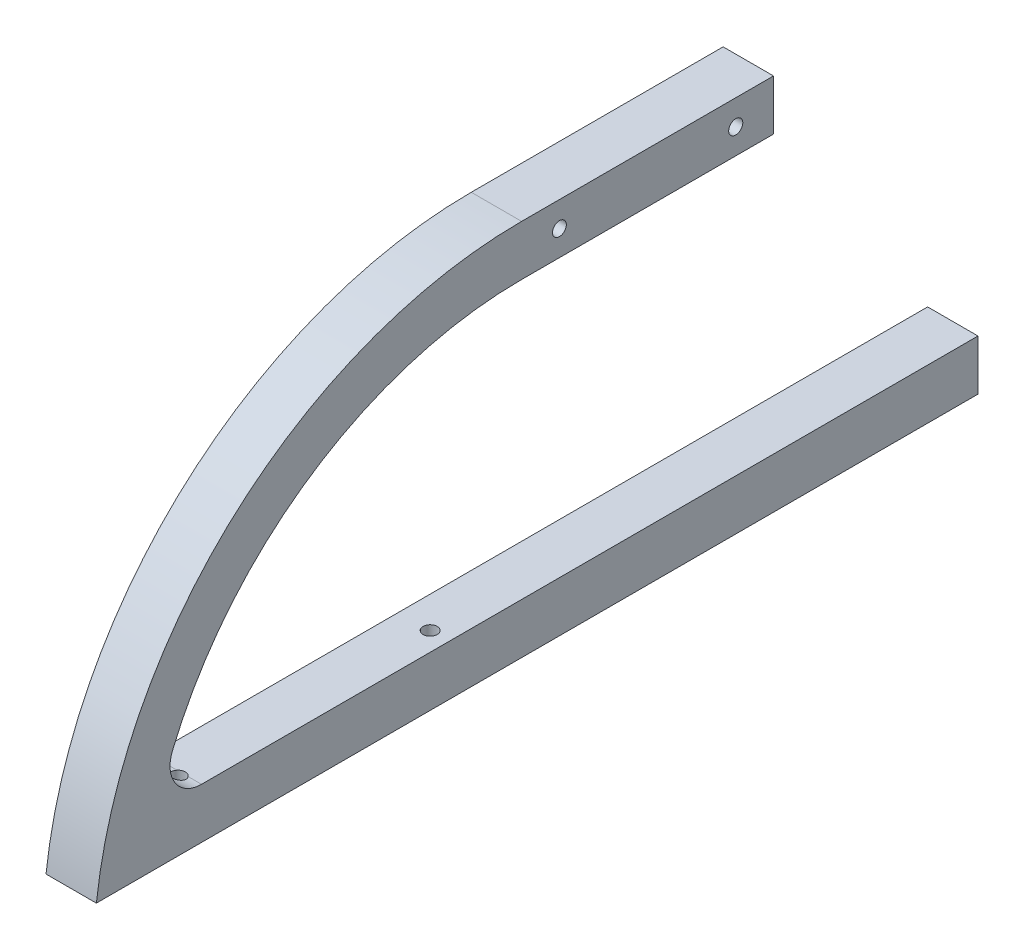
ISO-10303-21;
HEADER;
FILE_DESCRIPTION(('STEP AP214'),'2;1');
FILE_NAME('part.step','',(''),(''),'','','');
FILE_SCHEMA(('AUTOMOTIVE_DESIGN { 1 0 10303 214 1 1 1 1 }'));
ENDSEC;
DATA;
#1=APPLICATION_CONTEXT('core data for automotive mechanical design processes');
#2=APPLICATION_PROTOCOL_DEFINITION('international standard','automotive_design',2000,#1);
#3=PRODUCT_CONTEXT('',#1,'mechanical');
#4=PRODUCT('Part','Part','',(#3));
#5=PRODUCT_RELATED_PRODUCT_CATEGORY('part','',(#4));
#6=PRODUCT_DEFINITION_FORMATION('','',#4);
#7=PRODUCT_DEFINITION_CONTEXT('part definition',#1,'design');
#8=PRODUCT_DEFINITION('design','',#6,#7);
#9=PRODUCT_DEFINITION_SHAPE('','',#8);
#10=(LENGTH_UNIT() NAMED_UNIT(*) SI_UNIT(.MILLI.,.METRE.));
#11=(NAMED_UNIT(*) PLANE_ANGLE_UNIT() SI_UNIT($,.RADIAN.));
#12=(NAMED_UNIT(*) SI_UNIT($,.STERADIAN.) SOLID_ANGLE_UNIT());
#13=UNCERTAINTY_MEASURE_WITH_UNIT(LENGTH_MEASURE(1.E-05),#10,'distance_accuracy_value','');
#14=(GEOMETRIC_REPRESENTATION_CONTEXT(3) GLOBAL_UNCERTAINTY_ASSIGNED_CONTEXT((#13)) GLOBAL_UNIT_ASSIGNED_CONTEXT((#10,
#11,#12)) REPRESENTATION_CONTEXT('',''));
#15=CARTESIAN_POINT('',(0.,0.,0.));
#16=DIRECTION('',(0.,0.,1.));
#17=DIRECTION('',(1.,0.,0.));
#18=AXIS2_PLACEMENT_3D('',#15,#16,#17);
#19=CARTESIAN_POINT('',(0.,-86.36,50.8));
#20=DIRECTION('',(1.,0.,0.));
#21=DIRECTION('',(0.,0.,-1.));
#22=AXIS2_PLACEMENT_3D('',#19,#20,#21);
#23=PLANE('',#22);
#24=DIRECTION('',(0.,1.,0.));
#25=VECTOR('',#24,1.);
#26=CARTESIAN_POINT('',(0.,0.,0.));
#27=LINE('',#26,#25);
#28=CARTESIAN_POINT('',(0.,-10.16,0.));
#29=VERTEX_POINT('',#28);
#30=CARTESIAN_POINT('',(0.,0.,0.));
#31=VERTEX_POINT('',#30);
#32=EDGE_CURVE('E146',#29,#31,#27,.T.);
#33=ORIENTED_EDGE('',*,*,#32,.F.);
#34=DIRECTION('',(0.,0.,-1.));
#35=VECTOR('',#34,1.);
#36=CARTESIAN_POINT('',(0.,-10.16,0.));
#37=LINE('',#36,#35);
#38=CARTESIAN_POINT('',(0.,-10.16,50.8));
#39=VERTEX_POINT('',#38);
#40=EDGE_CURVE('E93',#39,#29,#37,.T.);
#41=ORIENTED_EDGE('',*,*,#40,.F.);
#42=CARTESIAN_POINT('',(0.,-86.36,50.8));
#43=DIRECTION('',(-1.,0.,0.));
#44=DIRECTION('',(0.,0.,-1.));
#45=AXIS2_PLACEMENT_3D('',#42,#43,#44);
#46=CIRCLE('',#45,76.2);
#47=CARTESIAN_POINT('',(0.,-57.2654545454546,121.226894186762));
#48=VERTEX_POINT('',#47);
#49=EDGE_CURVE('E162',#48,#39,#46,.T.);
#50=ORIENTED_EDGE('',*,*,#49,.F.);
#51=CARTESIAN_POINT('',(0.,-59.69,115.357986337865));
#52=DIRECTION('',(-1.,0.,0.));
#53=DIRECTION('',(0.,0.,1.));
#54=AXIS2_PLACEMENT_3D('',#51,#52,#53);
#55=CIRCLE('',#54,6.34999999999998);
#56=CARTESIAN_POINT('',(0.,-66.04,115.357986337865));
#57=VERTEX_POINT('',#56);
#58=EDGE_CURVE('E134',#57,#48,#55,.T.);
#59=ORIENTED_EDGE('',*,*,#58,.F.);
#60=DIRECTION('',(0.,0.,1.));
#61=VECTOR('',#60,1.);
#62=CARTESIAN_POINT('',(0.,-66.04,115.357986337865));
#63=LINE('',#62,#61);
#64=CARTESIAN_POINT('',(0.,-66.04,-41.2397294780386));
#65=VERTEX_POINT('',#64);
#66=EDGE_CURVE('E158',#65,#57,#63,.T.);
#67=ORIENTED_EDGE('',*,*,#66,.F.);
#68=DIRECTION('',(0.,1.,0.));
#69=VECTOR('',#68,1.);
#70=CARTESIAN_POINT('',(0.,-66.04,-41.2397294780386));
#71=LINE('',#70,#69);
#72=CARTESIAN_POINT('',(0.,-76.2,-41.2397294780386));
#73=VERTEX_POINT('',#72);
#74=EDGE_CURVE('E156',#73,#65,#71,.T.);
#75=ORIENTED_EDGE('',*,*,#74,.F.);
#76=DIRECTION('',(0.,0.,-1.));
#77=VECTOR('',#76,1.);
#78=CARTESIAN_POINT('',(0.,-76.2,136.560270521961));
#79=LINE('',#78,#77);
#80=CARTESIAN_POINT('',(0.,-76.2,136.560270521961));
#81=VERTEX_POINT('',#80);
#82=EDGE_CURVE('E154',#81,#73,#79,.T.);
#83=ORIENTED_EDGE('',*,*,#82,.F.);
#84=CARTESIAN_POINT('',(0.,-86.36,50.8));
#85=DIRECTION('',(1.,0.,0.));
#86=DIRECTION('',(0.,0.,-1.));
#87=AXIS2_PLACEMENT_3D('',#84,#85,#86);
#88=CIRCLE('',#87,86.36);
#89=CARTESIAN_POINT('',(0.,0.,50.8));
#90=VERTEX_POINT('',#89);
#91=EDGE_CURVE('E152',#90,#81,#88,.T.);
#92=ORIENTED_EDGE('',*,*,#91,.F.);
#93=DIRECTION('',(0.,0.,1.));
#94=VECTOR('',#93,1.);
#95=CARTESIAN_POINT('',(0.,0.,0.));
#96=LINE('',#95,#94);
#97=EDGE_CURVE('E149',#31,#90,#96,.T.);
#98=ORIENTED_EDGE('',*,*,#97,.F.);
#99=EDGE_LOOP('',(#33,#41,#50,#59,#67,#75,#83,#92,#98));
#100=FACE_BOUND('',#99,.T.);
#101=CARTESIAN_POINT('',(0.,-5.08,7.62));
#102=DIRECTION('',(-1.,0.,0.));
#103=DIRECTION('',(0.,0.,1.));
#104=AXIS2_PLACEMENT_3D('',#101,#102,#103);
#105=CIRCLE('',#104,3.8989);
#106=CARTESIAN_POINT('',(0.,-5.08,11.5189));
#107=VERTEX_POINT('',#106);
#108=EDGE_CURVE('E306',#107,#107,#105,.T.);
#109=ORIENTED_EDGE('',*,*,#108,.F.);
#110=EDGE_LOOP('',(#109));
#111=FACE_BOUND('',#110,.T.);
#112=CARTESIAN_POINT('',(0.,-5.08,43.18));
#113=DIRECTION('',(-1.,0.,0.));
#114=DIRECTION('',(0.,0.,1.));
#115=AXIS2_PLACEMENT_3D('',#112,#113,#114);
#116=CIRCLE('',#115,3.8989);
#117=CARTESIAN_POINT('',(0.,-5.08,47.0789));
#118=VERTEX_POINT('',#117);
#119=EDGE_CURVE('E316',#118,#118,#116,.T.);
#120=ORIENTED_EDGE('',*,*,#119,.F.);
#121=EDGE_LOOP('',(#120));
#122=FACE_BOUND('',#121,.T.);
#123=ADVANCED_FACE('F33',(#100,#111,#122),#23,.F.);
#124=CARTESIAN_POINT('',(10.16,0.,0.));
#125=DIRECTION('',(0.,0.,1.));
#126=DIRECTION('',(0.,-1.,0.));
#127=AXIS2_PLACEMENT_3D('',#124,#125,#126);
#128=PLANE('',#127);
#129=ORIENTED_EDGE('',*,*,#32,.T.);
#130=DIRECTION('',(-1.,0.,0.));
#131=VECTOR('',#130,1.);
#132=CARTESIAN_POINT('',(10.16,0.,0.));
#133=LINE('',#132,#131);
#134=CARTESIAN_POINT('',(10.16,0.,0.));
#135=VERTEX_POINT('',#134);
#136=EDGE_CURVE('E11',#135,#31,#133,.T.);
#137=ORIENTED_EDGE('',*,*,#136,.F.);
#138=DIRECTION('',(0.,1.,0.));
#139=VECTOR('',#138,1.);
#140=CARTESIAN_POINT('',(10.16,0.,0.));
#141=LINE('',#140,#139);
#142=CARTESIAN_POINT('',(10.16,-10.16,0.));
#143=VERTEX_POINT('',#142);
#144=EDGE_CURVE('E165',#143,#135,#141,.T.);
#145=ORIENTED_EDGE('',*,*,#144,.F.);
#146=DIRECTION('',(-1.,0.,0.));
#147=VECTOR('',#146,1.);
#148=CARTESIAN_POINT('',(10.16,-10.16,0.));
#149=LINE('',#148,#147);
#150=EDGE_CURVE('E142',#143,#29,#149,.T.);
#151=ORIENTED_EDGE('',*,*,#150,.T.);
#152=EDGE_LOOP('',(#129,#137,#145,#151));
#153=FACE_BOUND('',#152,.T.);
#154=ADVANCED_FACE('F35',(#153),#128,.F.);
#155=CARTESIAN_POINT('',(10.16,0.,0.));
#156=DIRECTION('',(0.,-1.,0.));
#157=DIRECTION('',(0.,0.,-1.));
#158=AXIS2_PLACEMENT_3D('',#155,#156,#157);
#159=PLANE('',#158);
#160=ORIENTED_EDGE('',*,*,#97,.T.);
#161=DIRECTION('',(-1.,0.,0.));
#162=VECTOR('',#161,1.);
#163=CARTESIAN_POINT('',(10.16,0.,50.8));
#164=LINE('',#163,#162);
#165=CARTESIAN_POINT('',(10.16,0.,50.8));
#166=VERTEX_POINT('',#165);
#167=EDGE_CURVE('E42',#166,#90,#164,.T.);
#168=ORIENTED_EDGE('',*,*,#167,.F.);
#169=DIRECTION('',(0.,0.,1.));
#170=VECTOR('',#169,1.);
#171=CARTESIAN_POINT('',(10.16,0.,0.));
#172=LINE('',#171,#170);
#173=EDGE_CURVE('E101',#135,#166,#172,.T.);
#174=ORIENTED_EDGE('',*,*,#173,.F.);
#175=ORIENTED_EDGE('',*,*,#136,.T.);
#176=EDGE_LOOP('',(#160,#168,#174,#175));
#177=FACE_BOUND('',#176,.T.);
#178=ADVANCED_FACE('F252',(#177),#159,.F.);
#179=CARTESIAN_POINT('',(10.16,-86.36,50.8));
#180=DIRECTION('',(-1.,0.,0.));
#181=DIRECTION('',(0.,0.,1.));
#182=AXIS2_PLACEMENT_3D('',#179,#180,#181);
#183=CYLINDRICAL_SURFACE('',#182,86.36);
#184=ORIENTED_EDGE('',*,*,#91,.T.);
#185=DIRECTION('',(-1.,0.,0.));
#186=VECTOR('',#185,1.);
#187=CARTESIAN_POINT('',(10.16,-76.2,136.560270521961));
#188=LINE('',#187,#186);
#189=CARTESIAN_POINT('',(10.16,-76.2,136.560270521961));
#190=VERTEX_POINT('',#189);
#191=EDGE_CURVE('E176',#190,#81,#188,.T.);
#192=ORIENTED_EDGE('',*,*,#191,.F.);
#193=CARTESIAN_POINT('',(10.16,-86.36,50.8));
#194=DIRECTION('',(1.,0.,0.));
#195=DIRECTION('',(0.,0.,-1.));
#196=AXIS2_PLACEMENT_3D('',#193,#194,#195);
#197=CIRCLE('',#196,86.36);
#198=EDGE_CURVE('E185',#166,#190,#197,.T.);
#199=ORIENTED_EDGE('',*,*,#198,.F.);
#200=ORIENTED_EDGE('',*,*,#167,.T.);
#201=EDGE_LOOP('',(#184,#192,#199,#200));
#202=FACE_BOUND('',#201,.T.);
#203=ADVANCED_FACE('F183',(#202),#183,.T.);
#204=CARTESIAN_POINT('',(10.16,-76.2,136.560270521961));
#205=DIRECTION('',(0.,1.,0.));
#206=DIRECTION('',(0.,0.,1.));
#207=AXIS2_PLACEMENT_3D('',#204,#205,#206);
#208=PLANE('',#207);
#209=CARTESIAN_POINT('',(6.35,-76.2,116.240270521961));
#210=DIRECTION('',(0.,-1.,0.));
#211=DIRECTION('',(0.,0.,-1.));
#212=AXIS2_PLACEMENT_3D('',#209,#210,#211);
#213=CIRCLE('',#212,1.4224);
#214=CARTESIAN_POINT('',(6.35,-76.2,114.817870521961));
#215=VERTEX_POINT('',#214);
#216=EDGE_CURVE('E213',#215,#215,#213,.T.);
#217=ORIENTED_EDGE('',*,*,#216,.F.);
#218=EDGE_LOOP('',(#217));
#219=FACE_BOUND('',#218,.T.);
#220=CARTESIAN_POINT('',(6.35,-76.2,65.4402705219614));
#221=DIRECTION('',(0.,-1.,0.));
#222=DIRECTION('',(0.,0.,-1.));
#223=AXIS2_PLACEMENT_3D('',#220,#221,#222);
#224=CIRCLE('',#223,1.4224);
#225=CARTESIAN_POINT('',(6.35,-76.2,64.0178705219614));
#226=VERTEX_POINT('',#225);
#227=EDGE_CURVE('E214',#226,#226,#224,.T.);
#228=ORIENTED_EDGE('',*,*,#227,.F.);
#229=EDGE_LOOP('',(#228));
#230=FACE_BOUND('',#229,.T.);
#231=ORIENTED_EDGE('',*,*,#82,.T.);
#232=DIRECTION('',(-1.,0.,0.));
#233=VECTOR('',#232,1.);
#234=CARTESIAN_POINT('',(10.16,-76.2,-41.2397294780386));
#235=LINE('',#234,#233);
#236=CARTESIAN_POINT('',(10.16,-76.2,-41.2397294780386));
#237=VERTEX_POINT('',#236);
#238=EDGE_CURVE('E173',#237,#73,#235,.T.);
#239=ORIENTED_EDGE('',*,*,#238,.F.);
#240=DIRECTION('',(0.,0.,-1.));
#241=VECTOR('',#240,1.);
#242=CARTESIAN_POINT('',(10.16,-76.2,136.560270521961));
#243=LINE('',#242,#241);
#244=EDGE_CURVE('E201',#190,#237,#243,.T.);
#245=ORIENTED_EDGE('',*,*,#244,.F.);
#246=ORIENTED_EDGE('',*,*,#191,.T.);
#247=EDGE_LOOP('',(#231,#239,#245,#246));
#248=FACE_BOUND('',#247,.T.);
#249=ADVANCED_FACE('F194',(#219,#230,#248),#208,.F.);
#250=CARTESIAN_POINT('',(10.16,-66.04,-41.2397294780386));
#251=DIRECTION('',(0.,0.,1.));
#252=DIRECTION('',(1.,0.,0.));
#253=AXIS2_PLACEMENT_3D('',#250,#251,#252);
#254=PLANE('',#253);
#255=ORIENTED_EDGE('',*,*,#74,.T.);
#256=DIRECTION('',(-1.,0.,0.));
#257=VECTOR('',#256,1.);
#258=CARTESIAN_POINT('',(10.16,-66.04,-41.2397294780386));
#259=LINE('',#258,#257);
#260=CARTESIAN_POINT('',(10.16,-66.04,-41.2397294780386));
#261=VERTEX_POINT('',#260);
#262=EDGE_CURVE('E170',#261,#65,#259,.T.);
#263=ORIENTED_EDGE('',*,*,#262,.F.);
#264=DIRECTION('',(0.,1.,0.));
#265=VECTOR('',#264,1.);
#266=CARTESIAN_POINT('',(10.16,-66.04,-41.2397294780386));
#267=LINE('',#266,#265);
#268=EDGE_CURVE('E200',#237,#261,#267,.T.);
#269=ORIENTED_EDGE('',*,*,#268,.F.);
#270=ORIENTED_EDGE('',*,*,#238,.T.);
#271=EDGE_LOOP('',(#255,#263,#269,#270));
#272=FACE_BOUND('',#271,.T.);
#273=ADVANCED_FACE('F198',(#272),#254,.F.);
#274=CARTESIAN_POINT('',(10.16,-66.04,115.357986337865));
#275=DIRECTION('',(0.,-1.,0.));
#276=DIRECTION('',(0.,0.,-1.));
#277=AXIS2_PLACEMENT_3D('',#274,#275,#276);
#278=PLANE('',#277);
#279=CARTESIAN_POINT('',(6.35,-66.04,65.4402705219614));
#280=DIRECTION('',(0.,-1.,0.));
#281=DIRECTION('',(0.,0.,-1.));
#282=AXIS2_PLACEMENT_3D('',#279,#280,#281);
#283=CIRCLE('',#282,1.4224);
#284=CARTESIAN_POINT('',(6.35,-66.04,64.0178705219614));
#285=VERTEX_POINT('',#284);
#286=EDGE_CURVE('E210',#285,#285,#283,.F.);
#287=ORIENTED_EDGE('',*,*,#286,.F.);
#288=EDGE_LOOP('',(#287));
#289=FACE_BOUND('',#288,.T.);
#290=DIRECTION('',(-1.,0.,0.));
#291=VECTOR('',#290,1.);
#292=CARTESIAN_POINT('',(10.16,-66.04,115.357986337865));
#293=LINE('',#292,#291);
#294=CARTESIAN_POINT('',(5.23429556848874,-66.04,115.357986337865));
#295=VERTEX_POINT('',#294);
#296=EDGE_CURVE('E137',#295,#57,#293,.T.);
#297=ORIENTED_EDGE('',*,*,#296,.F.);
#298=CARTESIAN_POINT('',(6.35,-66.04,116.240270521961));
#299=DIRECTION('',(0.,-1.,0.));
#300=DIRECTION('',(0.,0.,-1.));
#301=AXIS2_PLACEMENT_3D('',#298,#299,#300);
#302=CIRCLE('',#301,1.4224);
#303=CARTESIAN_POINT('',(7.46570443151126,-66.04,115.357986337865));
#304=VERTEX_POINT('',#303);
#305=EDGE_CURVE('E48',#304,#295,#302,.F.);
#306=ORIENTED_EDGE('',*,*,#305,.F.);
#307=CARTESIAN_POINT('',(10.16,-66.04,115.357986337865));
#308=VERTEX_POINT('',#307);
#309=EDGE_CURVE('E168',#308,#304,#293,.T.);
#310=ORIENTED_EDGE('',*,*,#309,.F.);
#311=DIRECTION('',(0.,0.,1.));
#312=VECTOR('',#311,1.);
#313=CARTESIAN_POINT('',(10.16,-66.04,115.357986337865));
#314=LINE('',#313,#312);
#315=EDGE_CURVE('E125',#261,#308,#314,.T.);
#316=ORIENTED_EDGE('',*,*,#315,.F.);
#317=ORIENTED_EDGE('',*,*,#262,.T.);
#318=ORIENTED_EDGE('',*,*,#66,.T.);
#319=EDGE_LOOP('',(#297,#306,#310,#316,#317,#318));
#320=FACE_BOUND('',#319,.T.);
#321=ADVANCED_FACE('F264',(#289,#320),#278,.F.);
#322=CARTESIAN_POINT('',(10.16,-59.69,115.357986337865));
#323=DIRECTION('',(-1.,0.,0.));
#324=DIRECTION('',(0.,0.,1.));
#325=AXIS2_PLACEMENT_3D('',#322,#323,#324);
#326=CYLINDRICAL_SURFACE('',#325,6.34999999999998);
#327=ORIENTED_EDGE('',*,*,#309,.T.);
#328=CARTESIAN_POINT('',(5.23429556848874,-66.04,115.357986337865));
#329=CARTESIAN_POINT('',(5.20988244436186,-66.0400004283094,115.388858396043));
#330=CARTESIAN_POINT('',(5.18676257572886,-66.0397745151044,115.420730263164));
#331=CARTESIAN_POINT('',(5.14324464580971,-66.038788684363,115.486272961052));
#332=CARTESIAN_POINT('',(5.12284658879113,-66.0380287659892,115.519943794639));
#333=CARTESIAN_POINT('',(5.06600683471812,-66.034829884935,115.623228875102));
#334=CARTESIAN_POINT('',(5.03383024931892,-66.0314723824016,115.695228882461));
#335=CARTESIAN_POINT('',(4.9818295477678,-66.0218556018953,115.843396702975));
#336=CARTESIAN_POINT('',(4.96201462164844,-66.0155941710686,115.919567571224));
#337=CARTESIAN_POINT('',(4.93520839911046,-65.9999998687168,116.073810001566));
#338=CARTESIAN_POINT('',(4.9282135554076,-65.9906678476595,116.151881031831));
#339=CARTESIAN_POINT('',(4.92706391682271,-65.969075829971,116.307665274214));
#340=CARTESIAN_POINT('',(4.9329036937862,-65.9568170731008,116.385378623677));
#341=CARTESIAN_POINT('',(4.95703988077849,-65.9298028226888,116.538411704328));
#342=CARTESIAN_POINT('',(4.97534054245545,-65.9150464782629,116.61373060935));
#343=CARTESIAN_POINT('',(5.02438646411037,-65.8833082936096,116.762029438603));
#344=CARTESIAN_POINT('',(5.05545113280283,-65.8662775291947,116.834893115699));
#345=CARTESIAN_POINT('',(5.1290857684445,-65.8312688905405,116.974306063313));
#346=CARTESIAN_POINT('',(5.17165764930955,-65.8132908591495,117.040854280934));
#347=CARTESIAN_POINT('',(5.26889382944747,-65.7768822793389,117.168208315592));
#348=CARTESIAN_POINT('',(5.32392538114319,-65.7584575808492,117.228735980186));
#349=CARTESIAN_POINT('',(5.44381625230118,-65.7231374148186,117.339690272461));
#350=CARTESIAN_POINT('',(5.50867647493665,-65.7062420880423,117.390115970867));
#351=CARTESIAN_POINT('',(5.64632578142684,-65.6754408802452,117.479121192699));
#352=CARTESIAN_POINT('',(5.71907996714481,-65.6615225895407,117.517750190517));
#353=CARTESIAN_POINT('',(5.8707434177293,-65.6378844052917,117.582026415699));
#354=CARTESIAN_POINT('',(5.94964970746943,-65.6281624970839,117.607679873578));
#355=CARTESIAN_POINT('',(6.10665057455048,-65.6143173192299,117.643882461096));
#356=CARTESIAN_POINT('',(6.18454401111525,-65.6099114939067,117.655195681573));
#357=CARTESIAN_POINT('',(6.34124123795467,-65.6061739079382,117.664805920865));
#358=CARTESIAN_POINT('',(6.42004474291344,-65.6068405979321,117.663106914163));
#359=CARTESIAN_POINT('',(6.57242547560867,-65.6130259824339,117.647162243959));
#360=CARTESIAN_POINT('',(6.64607490934497,-65.618316635803,117.633506210929));
#361=CARTESIAN_POINT('',(6.7899450727942,-65.6329633692791,117.5949725372));
#362=CARTESIAN_POINT('',(6.86016549053118,-65.6423198185332,117.570093877553));
#363=CARTESIAN_POINT('',(6.99671544147561,-65.6645301628902,117.509392252048));
#364=CARTESIAN_POINT('',(7.06294663813684,-65.6774466807197,117.473371760958));
#365=CARTESIAN_POINT('',(7.18855929618306,-65.70569654157,117.391643308409));
#366=CARTESIAN_POINT('',(7.24793878651646,-65.7210305770586,117.345932570002));
#367=CARTESIAN_POINT('',(7.36196263967613,-65.7540275763839,117.242968913348));
#368=CARTESIAN_POINT('',(7.41610362845113,-65.7717752962828,117.185185230437));
#369=CARTESIAN_POINT('',(7.51405166626233,-65.8075693848983,117.061508242584));
#370=CARTESIAN_POINT('',(7.55785617786234,-65.8256158257849,116.995612952402));
#371=CARTESIAN_POINT('',(7.63545656013483,-65.8615320959307,116.85470439547));
#372=CARTESIAN_POINT('',(7.66881710032417,-65.879370107683,116.779442371581));
#373=CARTESIAN_POINT('',(7.72215697186797,-65.9130467711359,116.623890947756));
#374=CARTESIAN_POINT('',(7.74213779535417,-65.9288856456242,116.543602109512));
#375=CARTESIAN_POINT('',(7.76769829648844,-65.9574876974297,116.381584824771));
#376=CARTESIAN_POINT('',(7.77350439435771,-65.9702962395719,116.299900291897));
#377=CARTESIAN_POINT('',(7.77094989944314,-65.9926622539956,116.13629200639));
#378=CARTESIAN_POINT('',(7.76259016080894,-66.0022199222515,116.054368268478));
#379=CARTESIAN_POINT('',(7.73233616303253,-66.0176668864073,115.895812323632));
#380=CARTESIAN_POINT('',(7.71094085094529,-66.0236760403634,115.819095832417));
#381=CARTESIAN_POINT('',(7.65557757701422,-66.0327576425655,115.670200264772));
#382=CARTESIAN_POINT('',(7.62162340873388,-66.035833299498,115.59801631156));
#383=CARTESIAN_POINT('',(7.56464759164531,-66.038498995904,115.499289086226));
#384=CARTESIAN_POINT('',(7.54628482611624,-66.0390765814098,115.469997479767));
#385=CARTESIAN_POINT('',(7.50751135045616,-66.0398266386398,115.412879452734));
#386=CARTESIAN_POINT('',(7.48710465518134,-66.0399998889268,115.385050317337));
#387=CARTESIAN_POINT('',(7.4657044315113,-66.04,115.357986337865));
#388=B_SPLINE_CURVE_WITH_KNOTS('',3,(#328,#329,#330,#331,#332,#333,#334,#335,#336,#337,#338,
#339,#340,#341,#342,#343,#344,#345,#346,#347,#348,#349,#350,#351,#352,#353,#354,#355,#356,#357,
#358,#359,#360,#361,#362,#363,#364,#365,#366,#367,#368,#369,#370,#371,#372,#373,#374,#375,#376,
#377,#378,#379,#380,#381,#382,#383,#384,#385,#386,#387),.UNSPECIFIED.,.F.,.F.,(4,2,2,2,2,2,2,2,
2,2,2,2,2,2,2,2,2,2,2,2,2,2,2,2,2,2,2,2,2,4),(0.,0.118004456886037,0.236009098791034,
0.471591356027589,0.707348544204094,0.943040489111693,1.17863277185446,1.41430547888362,
1.65627443492531,1.89828366079754,2.14866164624769,2.39906265332191,2.64839860163888,
2.89761471145371,3.13290124825732,3.3681159214808,3.59234613885113,3.81659671908707,
4.0450758796081,4.2736206044316,4.51598375257635,4.75840633516089,5.00989069214432,
5.26134699843563,5.50875959187095,5.75615726773632,5.99463340052123,6.2328483857175,
6.33650023641894,6.43995233630788),.UNSPECIFIED.);
#389=EDGE_CURVE('E218',#295,#304,#388,.T.);
#390=ORIENTED_EDGE('',*,*,#389,.F.);
#391=ORIENTED_EDGE('',*,*,#296,.T.);
#392=ORIENTED_EDGE('',*,*,#58,.T.);
#393=DIRECTION('',(-1.,0.,0.));
#394=VECTOR('',#393,1.);
#395=CARTESIAN_POINT('',(10.16,-57.2654545454546,121.226894186762));
#396=LINE('',#395,#394);
#397=CARTESIAN_POINT('',(10.16,-57.2654545454546,121.226894186762));
#398=VERTEX_POINT('',#397);
#399=EDGE_CURVE('E131',#398,#48,#396,.T.);
#400=ORIENTED_EDGE('',*,*,#399,.F.);
#401=CARTESIAN_POINT('',(10.16,-59.69,115.357986337865));
#402=DIRECTION('',(-1.,0.,0.));
#403=DIRECTION('',(0.,0.,1.));
#404=AXIS2_PLACEMENT_3D('',#401,#402,#403);
#405=CIRCLE('',#404,6.34999999999998);
#406=EDGE_CURVE('E118',#308,#398,#405,.T.);
#407=ORIENTED_EDGE('',*,*,#406,.F.);
#408=EDGE_LOOP('',(#327,#390,#391,#392,#400,#407));
#409=FACE_BOUND('',#408,.T.);
#410=ADVANCED_FACE('F132',(#409),#326,.F.);
#411=CARTESIAN_POINT('',(10.16,-86.36,50.8));
#412=DIRECTION('',(-1.,0.,0.));
#413=DIRECTION('',(0.,0.,1.));
#414=AXIS2_PLACEMENT_3D('',#411,#412,#413);
#415=CYLINDRICAL_SURFACE('',#414,76.2);
#416=ORIENTED_EDGE('',*,*,#49,.T.);
#417=DIRECTION('',(-1.,0.,0.));
#418=VECTOR('',#417,1.);
#419=CARTESIAN_POINT('',(10.16,-10.16,50.8));
#420=LINE('',#419,#418);
#421=CARTESIAN_POINT('',(10.16,-10.16,50.8));
#422=VERTEX_POINT('',#421);
#423=EDGE_CURVE('E138',#422,#39,#420,.T.);
#424=ORIENTED_EDGE('',*,*,#423,.F.);
#425=CARTESIAN_POINT('',(10.16,-86.36,50.8));
#426=DIRECTION('',(-1.,0.,0.));
#427=DIRECTION('',(0.,0.,-1.));
#428=AXIS2_PLACEMENT_3D('',#425,#426,#427);
#429=CIRCLE('',#428,76.2);
#430=EDGE_CURVE('E122',#398,#422,#429,.T.);
#431=ORIENTED_EDGE('',*,*,#430,.F.);
#432=ORIENTED_EDGE('',*,*,#399,.T.);
#433=EDGE_LOOP('',(#416,#424,#431,#432));
#434=FACE_BOUND('',#433,.T.);
#435=ADVANCED_FACE('F140',(#434),#415,.F.);
#436=CARTESIAN_POINT('',(10.16,-10.16,0.));
#437=DIRECTION('',(0.,1.,0.));
#438=DIRECTION('',(0.,0.,1.));
#439=AXIS2_PLACEMENT_3D('',#436,#437,#438);
#440=PLANE('',#439);
#441=ORIENTED_EDGE('',*,*,#40,.T.);
#442=ORIENTED_EDGE('',*,*,#150,.F.);
#443=DIRECTION('',(0.,0.,-1.));
#444=VECTOR('',#443,1.);
#445=CARTESIAN_POINT('',(10.16,-10.16,0.));
#446=LINE('',#445,#444);
#447=EDGE_CURVE('E57',#422,#143,#446,.T.);
#448=ORIENTED_EDGE('',*,*,#447,.F.);
#449=ORIENTED_EDGE('',*,*,#423,.T.);
#450=EDGE_LOOP('',(#441,#442,#448,#449));
#451=FACE_BOUND('',#450,.T.);
#452=ADVANCED_FACE('F257',(#451),#440,.F.);
#453=CARTESIAN_POINT('',(10.16,-86.36,50.8));
#454=DIRECTION('',(1.,0.,0.));
#455=DIRECTION('',(0.,0.,-1.));
#456=AXIS2_PLACEMENT_3D('',#453,#454,#455);
#457=PLANE('',#456);
#458=CARTESIAN_POINT('',(10.16,-5.08,43.18));
#459=DIRECTION('',(-1.,0.,0.));
#460=DIRECTION('',(0.,0.,1.));
#461=AXIS2_PLACEMENT_3D('',#458,#459,#460);
#462=CIRCLE('',#461,1.397);
#463=CARTESIAN_POINT('',(10.16,-5.08,44.577));
#464=VERTEX_POINT('',#463);
#465=EDGE_CURVE('E308',#464,#464,#462,.T.);
#466=ORIENTED_EDGE('',*,*,#465,.T.);
#467=EDGE_LOOP('',(#466));
#468=FACE_BOUND('',#467,.T.);
#469=CARTESIAN_POINT('',(10.16,-5.08,7.62));
#470=DIRECTION('',(1.,0.,0.));
#471=DIRECTION('',(0.,0.,-1.));
#472=AXIS2_PLACEMENT_3D('',#469,#470,#471);
#473=CIRCLE('',#472,1.4224);
#474=CARTESIAN_POINT('',(10.16,-5.08,6.1976));
#475=VERTEX_POINT('',#474);
#476=EDGE_CURVE('E150',#475,#475,#473,.T.);
#477=ORIENTED_EDGE('',*,*,#476,.F.);
#478=EDGE_LOOP('',(#477));
#479=FACE_BOUND('',#478,.T.);
#480=ORIENTED_EDGE('',*,*,#144,.T.);
#481=ORIENTED_EDGE('',*,*,#173,.T.);
#482=ORIENTED_EDGE('',*,*,#198,.T.);
#483=ORIENTED_EDGE('',*,*,#244,.T.);
#484=ORIENTED_EDGE('',*,*,#268,.T.);
#485=ORIENTED_EDGE('',*,*,#315,.T.);
#486=ORIENTED_EDGE('',*,*,#406,.T.);
#487=ORIENTED_EDGE('',*,*,#430,.T.);
#488=ORIENTED_EDGE('',*,*,#447,.T.);
#489=EDGE_LOOP('',(#480,#481,#482,#483,#484,#485,#486,#487,#488));
#490=FACE_BOUND('',#489,.T.);
#491=ADVANCED_FACE('F120',(#468,#479,#490),#457,.T.);
#492=CARTESIAN_POINT('',(0.,-5.08,7.62));
#493=DIRECTION('',(1.,0.,0.));
#494=DIRECTION('',(0.,0.,-1.));
#495=AXIS2_PLACEMENT_3D('',#492,#493,#494);
#496=CYLINDRICAL_SURFACE('',#495,1.4224);
#497=CARTESIAN_POINT('',(2.84888736048284,-5.08,7.62));
#498=DIRECTION('',(-1.,0.,0.));
#499=DIRECTION('',(0.,0.,1.));
#500=AXIS2_PLACEMENT_3D('',#497,#498,#499);
#501=CIRCLE('',#500,1.4224);
#502=CARTESIAN_POINT('',(2.84888736048284,-5.08,9.0424));
#503=VERTEX_POINT('',#502);
#504=EDGE_CURVE('E37',#503,#503,#501,.T.);
#505=ORIENTED_EDGE('',*,*,#504,.T.);
#506=EDGE_LOOP('',(#505));
#507=FACE_BOUND('',#506,.T.);
#508=ORIENTED_EDGE('',*,*,#476,.T.);
#509=EDGE_LOOP('',(#508));
#510=FACE_BOUND('',#509,.T.);
#511=ADVANCED_FACE('F282',(#507,#510),#496,.F.);
#512=CARTESIAN_POINT('',(6.35,0.00100000000001488,116.240270521961));
#513=DIRECTION('',(0.,-1.,0.));
#514=DIRECTION('',(0.,0.,-1.));
#515=AXIS2_PLACEMENT_3D('',#512,#513,#514);
#516=CYLINDRICAL_SURFACE('',#515,1.4224);
#517=ORIENTED_EDGE('',*,*,#216,.T.);
#518=EDGE_LOOP('',(#517));
#519=FACE_BOUND('',#518,.T.);
#520=ORIENTED_EDGE('',*,*,#305,.T.);
#521=ORIENTED_EDGE('',*,*,#389,.T.);
#522=EDGE_LOOP('',(#520,#521));
#523=FACE_BOUND('',#522,.T.);
#524=ADVANCED_FACE('F226',(#519,#523),#516,.F.);
#525=CARTESIAN_POINT('',(6.35,0.00100000000001488,65.4402705219614));
#526=DIRECTION('',(0.,-1.,0.));
#527=DIRECTION('',(0.,0.,-1.));
#528=AXIS2_PLACEMENT_3D('',#525,#526,#527);
#529=CYLINDRICAL_SURFACE('',#528,1.4224);
#530=ORIENTED_EDGE('',*,*,#227,.T.);
#531=EDGE_LOOP('',(#530));
#532=FACE_BOUND('',#531,.T.);
#533=ORIENTED_EDGE('',*,*,#286,.T.);
#534=EDGE_LOOP('',(#533));
#535=FACE_BOUND('',#534,.T.);
#536=ADVANCED_FACE('F235',(#532,#535),#529,.F.);
#537=CARTESIAN_POINT('',(0.,-5.08,7.62));
#538=DIRECTION('',(-1.,0.,0.));
#539=DIRECTION('',(0.,0.,1.));
#540=AXIS2_PLACEMENT_3D('',#537,#538,#539);
#541=CONICAL_SURFACE('',#540,3.8989,0.715584993317673);
#542=ORIENTED_EDGE('',*,*,#108,.T.);
#543=EDGE_LOOP('',(#542));
#544=FACE_BOUND('',#543,.T.);
#545=ORIENTED_EDGE('',*,*,#504,.F.);
#546=EDGE_LOOP('',(#545));
#547=FACE_BOUND('',#546,.T.);
#548=ADVANCED_FACE('F231',(#544,#547),#541,.F.);
#549=CARTESIAN_POINT('',(0.,-5.08,43.18));
#550=DIRECTION('',(-1.,0.,0.));
#551=DIRECTION('',(0.,0.,1.));
#552=AXIS2_PLACEMENT_3D('',#549,#550,#551);
#553=CYLINDRICAL_SURFACE('',#552,1.39699999999999);
#554=ORIENTED_EDGE('',*,*,#465,.F.);
#555=EDGE_LOOP('',(#554));
#556=FACE_BOUND('',#555,.T.);
#557=CARTESIAN_POINT('',(2.87810671802627,-5.08,43.18));
#558=DIRECTION('',(-1.,0.,0.));
#559=DIRECTION('',(0.,0.,1.));
#560=AXIS2_PLACEMENT_3D('',#557,#558,#559);
#561=CIRCLE('',#560,1.39699999999999);
#562=CARTESIAN_POINT('',(2.87810671802627,-5.08,44.577));
#563=VERTEX_POINT('',#562);
#564=EDGE_CURVE('E311',#563,#563,#561,.T.);
#565=ORIENTED_EDGE('',*,*,#564,.T.);
#566=EDGE_LOOP('',(#565));
#567=FACE_BOUND('',#566,.T.);
#568=ADVANCED_FACE('F234',(#556,#567),#553,.F.);
#569=CARTESIAN_POINT('',(0.,-5.08,43.18));
#570=DIRECTION('',(-1.,0.,0.));
#571=DIRECTION('',(0.,0.,1.));
#572=AXIS2_PLACEMENT_3D('',#569,#570,#571);
#573=CONICAL_SURFACE('',#572,3.8989,0.715584993317673);
#574=ORIENTED_EDGE('',*,*,#564,.F.);
#575=EDGE_LOOP('',(#574));
#576=FACE_BOUND('',#575,.T.);
#577=ORIENTED_EDGE('',*,*,#119,.T.);
#578=EDGE_LOOP('',(#577));
#579=FACE_BOUND('',#578,.T.);
#580=ADVANCED_FACE('F239',(#576,#579),#573,.F.);
#581=CLOSED_SHELL('',(#123,#154,#178,#203,#249,#273,#321,#410,#435,#452,#491,#511,#524,#536,
#548,#568,#580));
#582=MANIFOLD_SOLID_BREP('B2',#581);
#583=ADVANCED_BREP_SHAPE_REPRESENTATION('',(#18,#582),#14);
#584=SHAPE_DEFINITION_REPRESENTATION(#9,#583);
ENDSEC;
END-ISO-10303-21;
